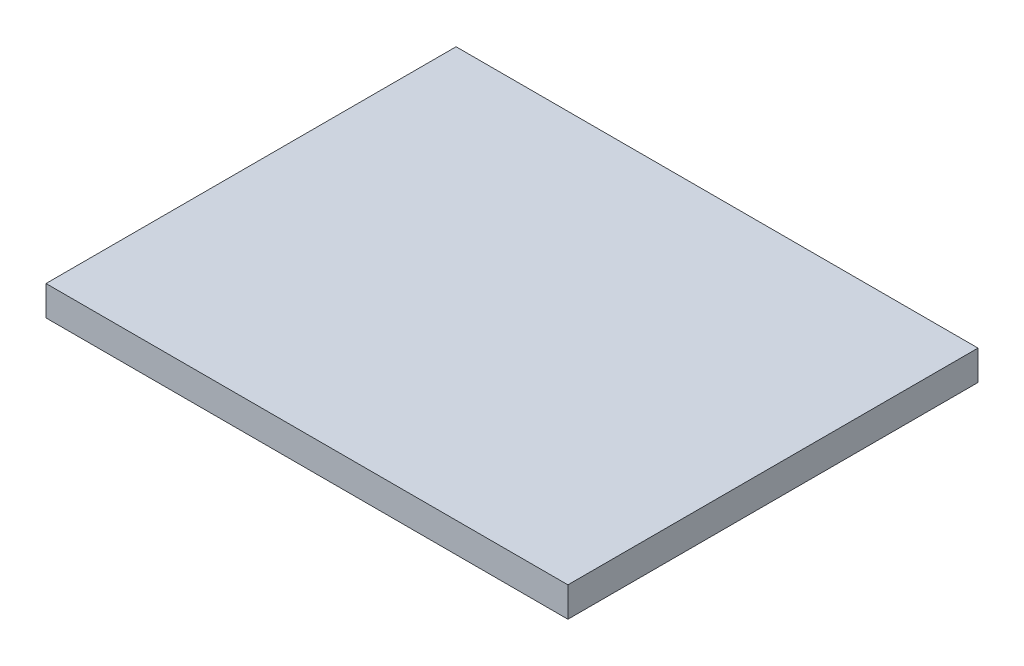
ISO-10303-21;
HEADER;
FILE_DESCRIPTION(('STEP AP214'),'2;1');
FILE_NAME('part.step','',(''),(''),'','','');
FILE_SCHEMA(('AUTOMOTIVE_DESIGN { 1 0 10303 214 1 1 1 1 }'));
ENDSEC;
DATA;
#1=APPLICATION_CONTEXT('core data for automotive mechanical design processes');
#2=APPLICATION_PROTOCOL_DEFINITION('international standard','automotive_design',2000,#1);
#3=PRODUCT_CONTEXT('',#1,'mechanical');
#4=PRODUCT('Part','Part','',(#3));
#5=PRODUCT_RELATED_PRODUCT_CATEGORY('part','',(#4));
#6=PRODUCT_DEFINITION_FORMATION('','',#4);
#7=PRODUCT_DEFINITION_CONTEXT('part definition',#1,'design');
#8=PRODUCT_DEFINITION('design','',#6,#7);
#9=PRODUCT_DEFINITION_SHAPE('','',#8);
#10=(LENGTH_UNIT() NAMED_UNIT(*) SI_UNIT(.MILLI.,.METRE.));
#11=(NAMED_UNIT(*) PLANE_ANGLE_UNIT() SI_UNIT($,.RADIAN.));
#12=(NAMED_UNIT(*) SI_UNIT($,.STERADIAN.) SOLID_ANGLE_UNIT());
#13=UNCERTAINTY_MEASURE_WITH_UNIT(LENGTH_MEASURE(1.E-05),#10,'distance_accuracy_value','');
#14=(GEOMETRIC_REPRESENTATION_CONTEXT(3) GLOBAL_UNCERTAINTY_ASSIGNED_CONTEXT((#13)) GLOBAL_UNIT_ASSIGNED_CONTEXT((#10,
#11,#12)) REPRESENTATION_CONTEXT('',''));
#15=CARTESIAN_POINT('',(0.,0.,0.));
#16=DIRECTION('',(0.,0.,1.));
#17=DIRECTION('',(1.,0.,0.));
#18=AXIS2_PLACEMENT_3D('',#15,#16,#17);
#19=CARTESIAN_POINT('',(35.,4.,-27.5));
#20=DIRECTION('',(-1.,0.,0.));
#21=DIRECTION('',(0.,0.,1.));
#22=AXIS2_PLACEMENT_3D('',#19,#20,#21);
#23=PLANE('',#22);
#24=DIRECTION('',(0.,0.,-1.));
#25=VECTOR('',#24,1.);
#26=CARTESIAN_POINT('',(35.,0.,-27.5));
#27=LINE('',#26,#25);
#28=CARTESIAN_POINT('',(35.,0.,27.5));
#29=VERTEX_POINT('',#28);
#30=CARTESIAN_POINT('',(35.,0.,-27.5));
#31=VERTEX_POINT('',#30);
#32=EDGE_CURVE('E96',#29,#31,#27,.T.);
#33=ORIENTED_EDGE('',*,*,#32,.T.);
#34=DIRECTION('',(0.,-1.,0.));
#35=VECTOR('',#34,1.);
#36=CARTESIAN_POINT('',(35.,4.,-27.5));
#37=LINE('',#36,#35);
#38=CARTESIAN_POINT('',(35.,4.,-27.5));
#39=VERTEX_POINT('',#38);
#40=EDGE_CURVE('E11',#39,#31,#37,.T.);
#41=ORIENTED_EDGE('',*,*,#40,.F.);
#42=DIRECTION('',(0.,0.,-1.));
#43=VECTOR('',#42,1.);
#44=CARTESIAN_POINT('',(35.,4.,-27.5));
#45=LINE('',#44,#43);
#46=CARTESIAN_POINT('',(35.,4.,27.5));
#47=VERTEX_POINT('',#46);
#48=EDGE_CURVE('E84',#47,#39,#45,.T.);
#49=ORIENTED_EDGE('',*,*,#48,.F.);
#50=DIRECTION('',(0.,-1.,0.));
#51=VECTOR('',#50,1.);
#52=CARTESIAN_POINT('',(35.,4.,27.5));
#53=LINE('',#52,#51);
#54=EDGE_CURVE('E92',#47,#29,#53,.T.);
#55=ORIENTED_EDGE('',*,*,#54,.T.);
#56=EDGE_LOOP('',(#33,#41,#49,#55));
#57=FACE_BOUND('',#56,.T.);
#58=ADVANCED_FACE('F33',(#57),#23,.F.);
#59=CARTESIAN_POINT('',(-35.,4.,-27.5));
#60=DIRECTION('',(0.,0.,1.));
#61=DIRECTION('',(1.,0.,0.));
#62=AXIS2_PLACEMENT_3D('',#59,#60,#61);
#63=PLANE('',#62);
#64=DIRECTION('',(-1.,0.,0.));
#65=VECTOR('',#64,1.);
#66=CARTESIAN_POINT('',(-35.,0.,-27.5));
#67=LINE('',#66,#65);
#68=CARTESIAN_POINT('',(-35.,0.,-27.5));
#69=VERTEX_POINT('',#68);
#70=EDGE_CURVE('E88',#31,#69,#67,.T.);
#71=ORIENTED_EDGE('',*,*,#70,.T.);
#72=DIRECTION('',(0.,-1.,0.));
#73=VECTOR('',#72,1.);
#74=CARTESIAN_POINT('',(-35.,4.,-27.5));
#75=LINE('',#74,#73);
#76=CARTESIAN_POINT('',(-35.,4.,-27.5));
#77=VERTEX_POINT('',#76);
#78=EDGE_CURVE('E41',#77,#69,#75,.T.);
#79=ORIENTED_EDGE('',*,*,#78,.F.);
#80=DIRECTION('',(-1.,0.,0.));
#81=VECTOR('',#80,1.);
#82=CARTESIAN_POINT('',(-35.,4.,-27.5));
#83=LINE('',#82,#81);
#84=EDGE_CURVE('E79',#39,#77,#83,.T.);
#85=ORIENTED_EDGE('',*,*,#84,.F.);
#86=ORIENTED_EDGE('',*,*,#40,.T.);
#87=EDGE_LOOP('',(#71,#79,#85,#86));
#88=FACE_BOUND('',#87,.T.);
#89=ADVANCED_FACE('F87',(#88),#63,.F.);
#90=CARTESIAN_POINT('',(-35.,4.,-27.5));
#91=DIRECTION('',(1.,0.,0.));
#92=DIRECTION('',(0.,0.,-1.));
#93=AXIS2_PLACEMENT_3D('',#90,#91,#92);
#94=PLANE('',#93);
#95=DIRECTION('',(0.,0.,1.));
#96=VECTOR('',#95,1.);
#97=CARTESIAN_POINT('',(-35.,0.,-27.5));
#98=LINE('',#97,#96);
#99=CARTESIAN_POINT('',(-35.,0.,27.5));
#100=VERTEX_POINT('',#99);
#101=EDGE_CURVE('E66',#69,#100,#98,.T.);
#102=ORIENTED_EDGE('',*,*,#101,.T.);
#103=DIRECTION('',(0.,-1.,0.));
#104=VECTOR('',#103,1.);
#105=CARTESIAN_POINT('',(-35.,4.,27.5));
#106=LINE('',#105,#104);
#107=CARTESIAN_POINT('',(-35.,4.,27.5));
#108=VERTEX_POINT('',#107);
#109=EDGE_CURVE('E89',#108,#100,#106,.T.);
#110=ORIENTED_EDGE('',*,*,#109,.F.);
#111=DIRECTION('',(0.,0.,1.));
#112=VECTOR('',#111,1.);
#113=CARTESIAN_POINT('',(-35.,4.,-27.5));
#114=LINE('',#113,#112);
#115=EDGE_CURVE('E82',#77,#108,#114,.T.);
#116=ORIENTED_EDGE('',*,*,#115,.F.);
#117=ORIENTED_EDGE('',*,*,#78,.T.);
#118=EDGE_LOOP('',(#102,#110,#116,#117));
#119=FACE_BOUND('',#118,.T.);
#120=ADVANCED_FACE('F90',(#119),#94,.F.);
#121=CARTESIAN_POINT('',(-35.,4.,27.5));
#122=DIRECTION('',(0.,0.,-1.));
#123=DIRECTION('',(-1.,0.,0.));
#124=AXIS2_PLACEMENT_3D('',#121,#122,#123);
#125=PLANE('',#124);
#126=DIRECTION('',(1.,0.,0.));
#127=VECTOR('',#126,1.);
#128=CARTESIAN_POINT('',(-35.,0.,27.5));
#129=LINE('',#128,#127);
#130=EDGE_CURVE('E72',#100,#29,#129,.T.);
#131=ORIENTED_EDGE('',*,*,#130,.T.);
#132=ORIENTED_EDGE('',*,*,#54,.F.);
#133=DIRECTION('',(1.,0.,0.));
#134=VECTOR('',#133,1.);
#135=CARTESIAN_POINT('',(-35.,4.,27.5));
#136=LINE('',#135,#134);
#137=EDGE_CURVE('E49',#108,#47,#136,.T.);
#138=ORIENTED_EDGE('',*,*,#137,.F.);
#139=ORIENTED_EDGE('',*,*,#109,.T.);
#140=EDGE_LOOP('',(#131,#132,#138,#139));
#141=FACE_BOUND('',#140,.T.);
#142=ADVANCED_FACE('F103',(#141),#125,.F.);
#143=CARTESIAN_POINT('',(0.,4.,0.));
#144=DIRECTION('',(0.,1.,0.));
#145=DIRECTION('',(0.,0.,1.));
#146=AXIS2_PLACEMENT_3D('',#143,#144,#145);
#147=PLANE('',#146);
#148=ORIENTED_EDGE('',*,*,#48,.T.);
#149=ORIENTED_EDGE('',*,*,#84,.T.);
#150=ORIENTED_EDGE('',*,*,#115,.T.);
#151=ORIENTED_EDGE('',*,*,#137,.T.);
#152=EDGE_LOOP('',(#148,#149,#150,#151));
#153=FACE_BOUND('',#152,.T.);
#154=ADVANCED_FACE('F80',(#153),#147,.T.);
#155=CARTESIAN_POINT('',(0.,0.,0.));
#156=DIRECTION('',(0.,1.,0.));
#157=DIRECTION('',(0.,0.,1.));
#158=AXIS2_PLACEMENT_3D('',#155,#156,#157);
#159=PLANE('',#158);
#160=ORIENTED_EDGE('',*,*,#32,.F.);
#161=ORIENTED_EDGE('',*,*,#130,.F.);
#162=ORIENTED_EDGE('',*,*,#101,.F.);
#163=ORIENTED_EDGE('',*,*,#70,.F.);
#164=EDGE_LOOP('',(#160,#161,#162,#163));
#165=FACE_BOUND('',#164,.T.);
#166=ADVANCED_FACE('F106',(#165),#159,.F.);
#167=CLOSED_SHELL('',(#58,#89,#120,#142,#154,#166));
#168=MANIFOLD_SOLID_BREP('B2',#167);
#169=ADVANCED_BREP_SHAPE_REPRESENTATION('',(#18,#168),#14);
#170=SHAPE_DEFINITION_REPRESENTATION(#9,#169);
ENDSEC;
END-ISO-10303-21;
